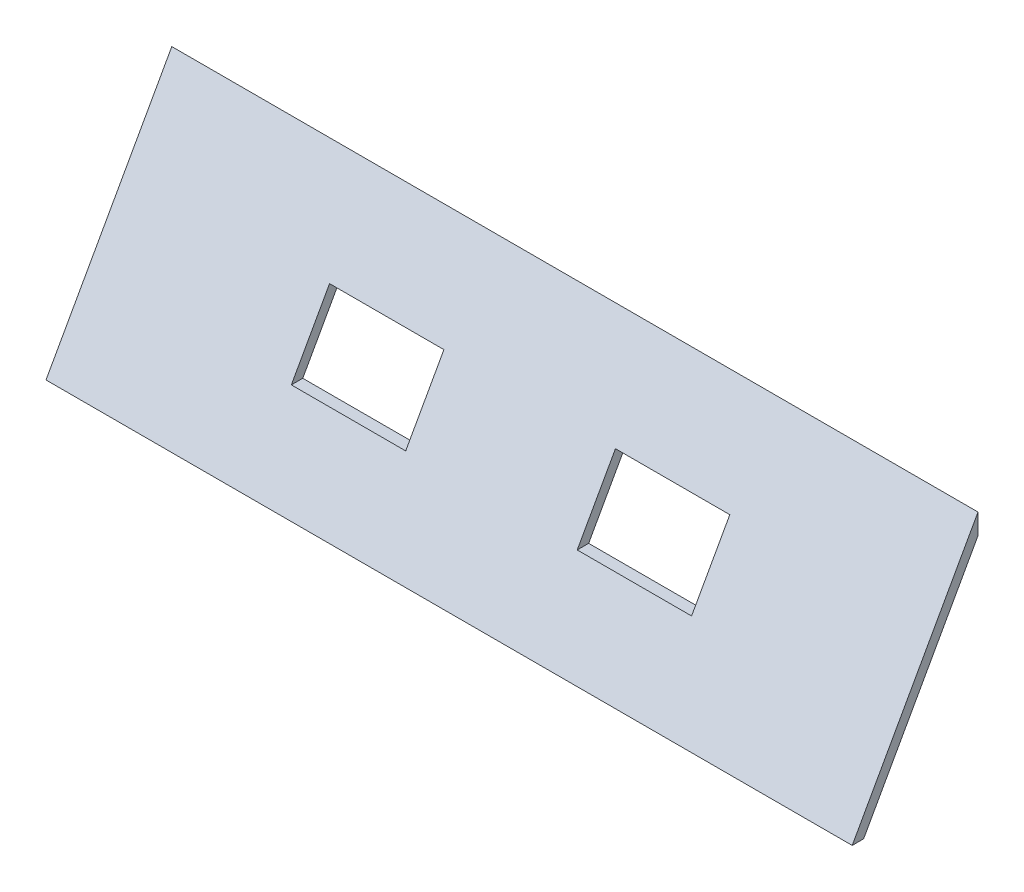
ISO-10303-21;
HEADER;
FILE_DESCRIPTION(('STEP AP214'),'2;1');
FILE_NAME('part.step','',(''),(''),'','','');
FILE_SCHEMA(('AUTOMOTIVE_DESIGN { 1 0 10303 214 1 1 1 1 }'));
ENDSEC;
DATA;
#1=APPLICATION_CONTEXT('core data for automotive mechanical design processes');
#2=APPLICATION_PROTOCOL_DEFINITION('international standard','automotive_design',2000,#1);
#3=PRODUCT_CONTEXT('',#1,'mechanical');
#4=PRODUCT('Part','Part','',(#3));
#5=PRODUCT_RELATED_PRODUCT_CATEGORY('part','',(#4));
#6=PRODUCT_DEFINITION_FORMATION('','',#4);
#7=PRODUCT_DEFINITION_CONTEXT('part definition',#1,'design');
#8=PRODUCT_DEFINITION('design','',#6,#7);
#9=PRODUCT_DEFINITION_SHAPE('','',#8);
#10=(LENGTH_UNIT() NAMED_UNIT(*) SI_UNIT(.MILLI.,.METRE.));
#11=(NAMED_UNIT(*) PLANE_ANGLE_UNIT() SI_UNIT($,.RADIAN.));
#12=(NAMED_UNIT(*) SI_UNIT($,.STERADIAN.) SOLID_ANGLE_UNIT());
#13=UNCERTAINTY_MEASURE_WITH_UNIT(LENGTH_MEASURE(1.E-05),#10,'distance_accuracy_value','');
#14=(GEOMETRIC_REPRESENTATION_CONTEXT(3) GLOBAL_UNCERTAINTY_ASSIGNED_CONTEXT((#13)) GLOBAL_UNIT_ASSIGNED_CONTEXT((#10,
#11,#12)) REPRESENTATION_CONTEXT('',''));
#15=CARTESIAN_POINT('',(0.,0.,0.));
#16=DIRECTION('',(0.,0.,1.));
#17=DIRECTION('',(1.,0.,0.));
#18=AXIS2_PLACEMENT_3D('',#15,#16,#17);
#19=CARTESIAN_POINT('',(-70.5,6.69872981077789,120.));
#20=DIRECTION('',(0.,0.486581594888014,0.873635136379162));
#21=DIRECTION('',(0.,-0.873635136379162,0.486581594888014));
#22=AXIS2_PLACEMENT_3D('',#19,#20,#21);
#23=PLANE('',#22);
#24=DIRECTION('',(0.,0.873635136379162,-0.486581594888014));
#25=VECTOR('',#24,1.);
#26=CARTESIAN_POINT('',(35.,6.69872981077789,120.));
#27=LINE('',#26,#25);
#28=CARTESIAN_POINT('',(35.,20.,112.591697617003));
#29=VERTEX_POINT('',#28);
#30=CARTESIAN_POINT('',(35.,32.,105.908153313993));
#31=VERTEX_POINT('',#30);
#32=EDGE_CURVE('E126',#29,#31,#27,.T.);
#33=ORIENTED_EDGE('',*,*,#32,.F.);
#34=DIRECTION('',(-1.,0.,0.));
#35=VECTOR('',#34,1.);
#36=CARTESIAN_POINT('',(-70.5,20.,112.591697617003));
#37=LINE('',#36,#35);
#38=CARTESIAN_POINT('',(15.,20.,112.591697617003));
#39=VERTEX_POINT('',#38);
#40=EDGE_CURVE('E132',#29,#39,#37,.T.);
#41=ORIENTED_EDGE('',*,*,#40,.T.);
#42=DIRECTION('',(0.,0.873635136379162,-0.486581594888014));
#43=VECTOR('',#42,1.);
#44=CARTESIAN_POINT('',(15.,6.69872981077789,120.));
#45=LINE('',#44,#43);
#46=CARTESIAN_POINT('',(15.,32.,105.908153313993));
#47=VERTEX_POINT('',#46);
#48=EDGE_CURVE('E121',#39,#47,#45,.T.);
#49=ORIENTED_EDGE('',*,*,#48,.T.);
#50=DIRECTION('',(1.,0.,0.));
#51=VECTOR('',#50,1.);
#52=CARTESIAN_POINT('',(-70.5,32.,105.908153313993));
#53=LINE('',#52,#51);
#54=EDGE_CURVE('E140',#47,#31,#53,.T.);
#55=ORIENTED_EDGE('',*,*,#54,.T.);
#56=EDGE_LOOP('',(#33,#41,#49,#55));
#57=FACE_BOUND('',#56,.T.);
#58=DIRECTION('',(1.,0.,0.));
#59=VECTOR('',#58,1.);
#60=CARTESIAN_POINT('',(-70.5,6.69872981077789,120.));
#61=LINE('',#60,#59);
#62=CARTESIAN_POINT('',(-70.5,6.69872981077789,120.));
#63=VERTEX_POINT('',#62);
#64=CARTESIAN_POINT('',(70.5,6.69872981077789,120.));
#65=VERTEX_POINT('',#64);
#66=EDGE_CURVE('E190',#63,#65,#61,.T.);
#67=ORIENTED_EDGE('',*,*,#66,.T.);
#68=DIRECTION('',(0.,-0.873635136379162,0.486581594888014));
#69=VECTOR('',#68,1.);
#70=CARTESIAN_POINT('',(70.5,6.69872981077789,120.));
#71=LINE('',#70,#69);
#72=CARTESIAN_POINT('',(70.5,46.1987298107779,98.0000000025926));
#73=VERTEX_POINT('',#72);
#74=EDGE_CURVE('E166',#73,#65,#71,.T.);
#75=ORIENTED_EDGE('',*,*,#74,.F.);
#76=DIRECTION('',(1.,0.,0.));
#77=VECTOR('',#76,1.);
#78=CARTESIAN_POINT('',(-70.5,46.1987298107779,98.0000000025926));
#79=LINE('',#78,#77);
#80=CARTESIAN_POINT('',(-70.5,46.1987298107779,98.0000000025926));
#81=VERTEX_POINT('',#80);
#82=EDGE_CURVE('E191',#81,#73,#79,.T.);
#83=ORIENTED_EDGE('',*,*,#82,.F.);
#84=DIRECTION('',(0.,-0.873635136379162,0.486581594888014));
#85=VECTOR('',#84,1.);
#86=CARTESIAN_POINT('',(-70.5,6.69872981077789,120.));
#87=LINE('',#86,#85);
#88=EDGE_CURVE('E178',#81,#63,#87,.T.);
#89=ORIENTED_EDGE('',*,*,#88,.T.);
#90=EDGE_LOOP('',(#67,#75,#83,#89));
#91=FACE_BOUND('',#90,.T.);
#92=DIRECTION('',(1.,0.,0.));
#93=VECTOR('',#92,1.);
#94=CARTESIAN_POINT('',(-70.5,20.,112.591697617003));
#95=LINE('',#94,#93);
#96=CARTESIAN_POINT('',(-35.,20.,112.591697617003));
#97=VERTEX_POINT('',#96);
#98=CARTESIAN_POINT('',(-15.,20.,112.591697617003));
#99=VERTEX_POINT('',#98);
#100=EDGE_CURVE('E163',#97,#99,#95,.T.);
#101=ORIENTED_EDGE('',*,*,#100,.F.);
#102=DIRECTION('',(0.,0.873635136379162,-0.486581594888014));
#103=VECTOR('',#102,1.);
#104=CARTESIAN_POINT('',(-35.,6.69872981077789,120.));
#105=LINE('',#104,#103);
#106=CARTESIAN_POINT('',(-35.,32.,105.908153313993));
#107=VERTEX_POINT('',#106);
#108=EDGE_CURVE('E158',#97,#107,#105,.T.);
#109=ORIENTED_EDGE('',*,*,#108,.T.);
#110=DIRECTION('',(-1.,0.,0.));
#111=VECTOR('',#110,1.);
#112=CARTESIAN_POINT('',(-70.5,32.,105.908153313993));
#113=LINE('',#112,#111);
#114=CARTESIAN_POINT('',(-15.,32.,105.908153313993));
#115=VERTEX_POINT('',#114);
#116=EDGE_CURVE('E161',#115,#107,#113,.T.);
#117=ORIENTED_EDGE('',*,*,#116,.F.);
#118=DIRECTION('',(0.,0.873635136379162,-0.486581594888014));
#119=VECTOR('',#118,1.);
#120=CARTESIAN_POINT('',(-15.,6.69872981077789,120.));
#121=LINE('',#120,#119);
#122=EDGE_CURVE('E153',#99,#115,#121,.T.);
#123=ORIENTED_EDGE('',*,*,#122,.F.);
#124=EDGE_LOOP('',(#101,#109,#117,#123));
#125=FACE_BOUND('',#124,.T.);
#126=ADVANCED_FACE('F37',(#57,#91,#125),#23,.T.);
#127=CARTESIAN_POINT('',(-70.5,6.69872981077789,118.));
#128=DIRECTION('',(0.,-0.486581594888014,-0.873635136379162));
#129=DIRECTION('',(0.,0.873635136379162,-0.486581594888014));
#130=AXIS2_PLACEMENT_3D('',#127,#128,#129);
#131=PLANE('',#130);
#132=DIRECTION('',(0.,-0.873635136379162,0.486581594888014));
#133=VECTOR('',#132,1.);
#134=CARTESIAN_POINT('',(35.,6.69872981077789,118.));
#135=LINE('',#134,#133);
#136=CARTESIAN_POINT('',(35.,32.,103.908153313993));
#137=VERTEX_POINT('',#136);
#138=CARTESIAN_POINT('',(35.,20.,110.591697617003));
#139=VERTEX_POINT('',#138);
#140=EDGE_CURVE('E11',#137,#139,#135,.T.);
#141=ORIENTED_EDGE('',*,*,#140,.F.);
#142=DIRECTION('',(-1.,0.,0.));
#143=VECTOR('',#142,1.);
#144=CARTESIAN_POINT('',(-70.5,32.,103.908153313993));
#145=LINE('',#144,#143);
#146=CARTESIAN_POINT('',(15.,32.,103.908153313993));
#147=VERTEX_POINT('',#146);
#148=EDGE_CURVE('E210',#137,#147,#145,.T.);
#149=ORIENTED_EDGE('',*,*,#148,.T.);
#150=DIRECTION('',(0.,-0.873635136379162,0.486581594888014));
#151=VECTOR('',#150,1.);
#152=CARTESIAN_POINT('',(15.,6.69872981077789,118.));
#153=LINE('',#152,#151);
#154=CARTESIAN_POINT('',(15.,20.,110.591697617003));
#155=VERTEX_POINT('',#154);
#156=EDGE_CURVE('E208',#147,#155,#153,.T.);
#157=ORIENTED_EDGE('',*,*,#156,.T.);
#158=DIRECTION('',(1.,0.,0.));
#159=VECTOR('',#158,1.);
#160=CARTESIAN_POINT('',(-70.5,20.,110.591697617003));
#161=LINE('',#160,#159);
#162=EDGE_CURVE('E44',#155,#139,#161,.T.);
#163=ORIENTED_EDGE('',*,*,#162,.T.);
#164=EDGE_LOOP('',(#141,#149,#157,#163));
#165=FACE_BOUND('',#164,.T.);
#166=DIRECTION('',(1.,0.,0.));
#167=VECTOR('',#166,1.);
#168=CARTESIAN_POINT('',(-70.5,42.6078207194456,98.0000000025926));
#169=LINE('',#168,#167);
#170=CARTESIAN_POINT('',(-70.5,42.6078207194456,98.0000000025926));
#171=VERTEX_POINT('',#170);
#172=CARTESIAN_POINT('',(70.5,42.6078207194456,98.0000000025926));
#173=VERTEX_POINT('',#172);
#174=EDGE_CURVE('E194',#171,#173,#169,.T.);
#175=ORIENTED_EDGE('',*,*,#174,.T.);
#176=DIRECTION('',(0.,0.873635136379162,-0.486581594888014));
#177=VECTOR('',#176,1.);
#178=CARTESIAN_POINT('',(70.5,6.69872981077789,118.));
#179=LINE('',#178,#177);
#180=CARTESIAN_POINT('',(70.5,6.69872981077789,118.));
#181=VERTEX_POINT('',#180);
#182=EDGE_CURVE('E172',#181,#173,#179,.T.);
#183=ORIENTED_EDGE('',*,*,#182,.F.);
#184=DIRECTION('',(1.,0.,0.));
#185=VECTOR('',#184,1.);
#186=CARTESIAN_POINT('',(-70.5,6.69872981077789,118.));
#187=LINE('',#186,#185);
#188=CARTESIAN_POINT('',(-70.5,6.69872981077789,118.));
#189=VERTEX_POINT('',#188);
#190=EDGE_CURVE('E196',#189,#181,#187,.T.);
#191=ORIENTED_EDGE('',*,*,#190,.F.);
#192=DIRECTION('',(0.,0.873635136379162,-0.486581594888014));
#193=VECTOR('',#192,1.);
#194=CARTESIAN_POINT('',(-70.5,6.69872981077789,118.));
#195=LINE('',#194,#193);
#196=EDGE_CURVE('E184',#189,#171,#195,.T.);
#197=ORIENTED_EDGE('',*,*,#196,.T.);
#198=EDGE_LOOP('',(#175,#183,#191,#197));
#199=FACE_BOUND('',#198,.T.);
#200=DIRECTION('',(1.,0.,0.));
#201=VECTOR('',#200,1.);
#202=CARTESIAN_POINT('',(-70.5,32.,103.908153313993));
#203=LINE('',#202,#201);
#204=CARTESIAN_POINT('',(-35.,32.,103.908153313993));
#205=VERTEX_POINT('',#204);
#206=CARTESIAN_POINT('',(-15.,32.,103.908153313993));
#207=VERTEX_POINT('',#206);
#208=EDGE_CURVE('E200',#205,#207,#203,.T.);
#209=ORIENTED_EDGE('',*,*,#208,.F.);
#210=DIRECTION('',(0.,-0.873635136379162,0.486581594888014));
#211=VECTOR('',#210,1.);
#212=CARTESIAN_POINT('',(-35.,6.69872981077789,118.));
#213=LINE('',#212,#211);
#214=CARTESIAN_POINT('',(-35.,20.,110.591697617003));
#215=VERTEX_POINT('',#214);
#216=EDGE_CURVE('E205',#205,#215,#213,.T.);
#217=ORIENTED_EDGE('',*,*,#216,.T.);
#218=DIRECTION('',(-1.,0.,0.));
#219=VECTOR('',#218,1.);
#220=CARTESIAN_POINT('',(-70.5,20.,110.591697617003));
#221=LINE('',#220,#219);
#222=CARTESIAN_POINT('',(-15.,20.,110.591697617003));
#223=VERTEX_POINT('',#222);
#224=EDGE_CURVE('E203',#223,#215,#221,.T.);
#225=ORIENTED_EDGE('',*,*,#224,.F.);
#226=DIRECTION('',(0.,-0.873635136379162,0.486581594888014));
#227=VECTOR('',#226,1.);
#228=CARTESIAN_POINT('',(-15.,6.69872981077789,118.));
#229=LINE('',#228,#227);
#230=EDGE_CURVE('E193',#207,#223,#229,.T.);
#231=ORIENTED_EDGE('',*,*,#230,.F.);
#232=EDGE_LOOP('',(#209,#217,#225,#231));
#233=FACE_BOUND('',#232,.T.);
#234=ADVANCED_FACE('F214',(#165,#199,#233),#131,.T.);
#235=CARTESIAN_POINT('',(-70.5,42.6078207194456,98.0000000025926));
#236=DIRECTION('',(0.,0.,-1.));
#237=DIRECTION('',(-1.,0.,0.));
#238=AXIS2_PLACEMENT_3D('',#235,#236,#237);
#239=PLANE('',#238);
#240=ORIENTED_EDGE('',*,*,#82,.T.);
#241=DIRECTION('',(0.,1.,0.));
#242=VECTOR('',#241,1.);
#243=CARTESIAN_POINT('',(70.5,42.6078207194456,98.0000000025926));
#244=LINE('',#243,#242);
#245=EDGE_CURVE('E175',#173,#73,#244,.T.);
#246=ORIENTED_EDGE('',*,*,#245,.F.);
#247=ORIENTED_EDGE('',*,*,#174,.F.);
#248=DIRECTION('',(0.,1.,0.));
#249=VECTOR('',#248,1.);
#250=CARTESIAN_POINT('',(-70.5,42.6078207194456,98.0000000025926));
#251=LINE('',#250,#249);
#252=EDGE_CURVE('E187',#171,#81,#251,.T.);
#253=ORIENTED_EDGE('',*,*,#252,.T.);
#254=EDGE_LOOP('',(#240,#246,#247,#253));
#255=FACE_BOUND('',#254,.T.);
#256=ADVANCED_FACE('F238',(#255),#239,.T.);
#257=CARTESIAN_POINT('',(-70.5,6.69872981077789,120.));
#258=DIRECTION('',(0.,-1.,0.));
#259=DIRECTION('',(0.,0.,-1.));
#260=AXIS2_PLACEMENT_3D('',#257,#258,#259);
#261=PLANE('',#260);
#262=ORIENTED_EDGE('',*,*,#190,.T.);
#263=DIRECTION('',(0.,0.,-1.));
#264=VECTOR('',#263,1.);
#265=CARTESIAN_POINT('',(70.5,6.69872981077789,120.));
#266=LINE('',#265,#264);
#267=EDGE_CURVE('E169',#65,#181,#266,.T.);
#268=ORIENTED_EDGE('',*,*,#267,.F.);
#269=ORIENTED_EDGE('',*,*,#66,.F.);
#270=DIRECTION('',(0.,0.,-1.));
#271=VECTOR('',#270,1.);
#272=CARTESIAN_POINT('',(-70.5,6.69872981077789,120.));
#273=LINE('',#272,#271);
#274=EDGE_CURVE('E181',#63,#189,#273,.T.);
#275=ORIENTED_EDGE('',*,*,#274,.T.);
#276=EDGE_LOOP('',(#262,#268,#269,#275));
#277=FACE_BOUND('',#276,.T.);
#278=ADVANCED_FACE('F243',(#277),#261,.T.);
#279=CARTESIAN_POINT('',(-70.5,0.,0.));
#280=DIRECTION('',(-1.,0.,0.));
#281=DIRECTION('',(0.,0.,1.));
#282=AXIS2_PLACEMENT_3D('',#279,#280,#281);
#283=PLANE('',#282);
#284=ORIENTED_EDGE('',*,*,#88,.F.);
#285=ORIENTED_EDGE('',*,*,#252,.F.);
#286=ORIENTED_EDGE('',*,*,#196,.F.);
#287=ORIENTED_EDGE('',*,*,#274,.F.);
#288=EDGE_LOOP('',(#284,#285,#286,#287));
#289=FACE_BOUND('',#288,.T.);
#290=ADVANCED_FACE('F248',(#289),#283,.T.);
#291=CARTESIAN_POINT('',(70.5,0.,0.));
#292=DIRECTION('',(-1.,0.,0.));
#293=DIRECTION('',(0.,0.,1.));
#294=AXIS2_PLACEMENT_3D('',#291,#292,#293);
#295=PLANE('',#294);
#296=ORIENTED_EDGE('',*,*,#74,.T.);
#297=ORIENTED_EDGE('',*,*,#267,.T.);
#298=ORIENTED_EDGE('',*,*,#182,.T.);
#299=ORIENTED_EDGE('',*,*,#245,.T.);
#300=EDGE_LOOP('',(#296,#297,#298,#299));
#301=FACE_BOUND('',#300,.T.);
#302=ADVANCED_FACE('F253',(#301),#295,.F.);
#303=CARTESIAN_POINT('',(-35.,20.,112.592592592593));
#304=DIRECTION('',(0.,-1.,0.));
#305=DIRECTION('',(0.,0.,-1.));
#306=AXIS2_PLACEMENT_3D('',#303,#304,#305);
#307=PLANE('',#306);
#308=ORIENTED_EDGE('',*,*,#100,.T.);
#309=DIRECTION('',(0.,0.,-1.));
#310=VECTOR('',#309,1.);
#311=CARTESIAN_POINT('',(-15.,20.,112.592592592593));
#312=LINE('',#311,#310);
#313=EDGE_CURVE('E139',#99,#223,#312,.T.);
#314=ORIENTED_EDGE('',*,*,#313,.T.);
#315=ORIENTED_EDGE('',*,*,#224,.T.);
#316=DIRECTION('',(0.,0.,-1.));
#317=VECTOR('',#316,1.);
#318=CARTESIAN_POINT('',(-35.,20.,112.592592592593));
#319=LINE('',#318,#317);
#320=EDGE_CURVE('E148',#97,#215,#319,.T.);
#321=ORIENTED_EDGE('',*,*,#320,.F.);
#322=EDGE_LOOP('',(#308,#314,#315,#321));
#323=FACE_BOUND('',#322,.T.);
#324=ADVANCED_FACE('F271',(#323),#307,.F.);
#325=CARTESIAN_POINT('',(-35.,32.,98.0000000025926));
#326=DIRECTION('',(0.,1.,0.));
#327=DIRECTION('',(0.,0.,1.));
#328=AXIS2_PLACEMENT_3D('',#325,#326,#327);
#329=PLANE('',#328);
#330=ORIENTED_EDGE('',*,*,#116,.T.);
#331=DIRECTION('',(0.,0.,1.));
#332=VECTOR('',#331,1.);
#333=CARTESIAN_POINT('',(-35.,32.,98.0000000025926));
#334=LINE('',#333,#332);
#335=EDGE_CURVE('E151',#205,#107,#334,.T.);
#336=ORIENTED_EDGE('',*,*,#335,.F.);
#337=ORIENTED_EDGE('',*,*,#208,.T.);
#338=DIRECTION('',(0.,0.,1.));
#339=VECTOR('',#338,1.);
#340=CARTESIAN_POINT('',(-15.,32.,98.0000000025926));
#341=LINE('',#340,#339);
#342=EDGE_CURVE('E143',#207,#115,#341,.T.);
#343=ORIENTED_EDGE('',*,*,#342,.T.);
#344=EDGE_LOOP('',(#330,#336,#337,#343));
#345=FACE_BOUND('',#344,.T.);
#346=ADVANCED_FACE('F279',(#345),#329,.F.);
#347=CARTESIAN_POINT('',(-35.,0.,0.));
#348=DIRECTION('',(1.,0.,0.));
#349=DIRECTION('',(0.,0.,-1.));
#350=AXIS2_PLACEMENT_3D('',#347,#348,#349);
#351=PLANE('',#350);
#352=ORIENTED_EDGE('',*,*,#320,.T.);
#353=ORIENTED_EDGE('',*,*,#216,.F.);
#354=ORIENTED_EDGE('',*,*,#335,.T.);
#355=ORIENTED_EDGE('',*,*,#108,.F.);
#356=EDGE_LOOP('',(#352,#353,#354,#355));
#357=FACE_BOUND('',#356,.T.);
#358=ADVANCED_FACE('F274',(#357),#351,.T.);
#359=CARTESIAN_POINT('',(-15.,0.,0.));
#360=DIRECTION('',(1.,0.,0.));
#361=DIRECTION('',(0.,0.,-1.));
#362=AXIS2_PLACEMENT_3D('',#359,#360,#361);
#363=PLANE('',#362);
#364=ORIENTED_EDGE('',*,*,#122,.T.);
#365=ORIENTED_EDGE('',*,*,#342,.F.);
#366=ORIENTED_EDGE('',*,*,#230,.T.);
#367=ORIENTED_EDGE('',*,*,#313,.F.);
#368=EDGE_LOOP('',(#364,#365,#366,#367));
#369=FACE_BOUND('',#368,.T.);
#370=ADVANCED_FACE('F281',(#369),#363,.F.);
#371=CARTESIAN_POINT('',(35.,20.,112.592592592593));
#372=DIRECTION('',(0.,1.,0.));
#373=DIRECTION('',(0.,0.,1.));
#374=AXIS2_PLACEMENT_3D('',#371,#372,#373);
#375=PLANE('',#374);
#376=DIRECTION('',(0.,0.,-1.));
#377=VECTOR('',#376,1.);
#378=CARTESIAN_POINT('',(35.,20.,112.592592592593));
#379=LINE('',#378,#377);
#380=EDGE_CURVE('E220',#29,#139,#379,.T.);
#381=ORIENTED_EDGE('',*,*,#380,.T.);
#382=ORIENTED_EDGE('',*,*,#162,.F.);
#383=DIRECTION('',(0.,0.,-1.));
#384=VECTOR('',#383,1.);
#385=CARTESIAN_POINT('',(15.,20.,112.592592592593));
#386=LINE('',#385,#384);
#387=EDGE_CURVE('E56',#39,#155,#386,.T.);
#388=ORIENTED_EDGE('',*,*,#387,.F.);
#389=ORIENTED_EDGE('',*,*,#40,.F.);
#390=EDGE_LOOP('',(#381,#382,#388,#389));
#391=FACE_BOUND('',#390,.T.);
#392=ADVANCED_FACE('F131',(#391),#375,.T.);
#393=CARTESIAN_POINT('',(35.,32.,98.0000000025926));
#394=DIRECTION('',(0.,-1.,0.));
#395=DIRECTION('',(0.,0.,-1.));
#396=AXIS2_PLACEMENT_3D('',#393,#394,#395);
#397=PLANE('',#396);
#398=DIRECTION('',(0.,0.,1.));
#399=VECTOR('',#398,1.);
#400=CARTESIAN_POINT('',(15.,32.,98.0000000025926));
#401=LINE('',#400,#399);
#402=EDGE_CURVE('E51',#147,#47,#401,.T.);
#403=ORIENTED_EDGE('',*,*,#402,.F.);
#404=ORIENTED_EDGE('',*,*,#148,.F.);
#405=DIRECTION('',(0.,0.,1.));
#406=VECTOR('',#405,1.);
#407=CARTESIAN_POINT('',(35.,32.,98.0000000025926));
#408=LINE('',#407,#406);
#409=EDGE_CURVE('E127',#137,#31,#408,.T.);
#410=ORIENTED_EDGE('',*,*,#409,.T.);
#411=ORIENTED_EDGE('',*,*,#54,.F.);
#412=EDGE_LOOP('',(#403,#404,#410,#411));
#413=FACE_BOUND('',#412,.T.);
#414=ADVANCED_FACE('F217',(#413),#397,.T.);
#415=CARTESIAN_POINT('',(35.,0.,0.));
#416=DIRECTION('',(1.,0.,0.));
#417=DIRECTION('',(0.,0.,-1.));
#418=AXIS2_PLACEMENT_3D('',#415,#416,#417);
#419=PLANE('',#418);
#420=ORIENTED_EDGE('',*,*,#32,.T.);
#421=ORIENTED_EDGE('',*,*,#409,.F.);
#422=ORIENTED_EDGE('',*,*,#140,.T.);
#423=ORIENTED_EDGE('',*,*,#380,.F.);
#424=EDGE_LOOP('',(#420,#421,#422,#423));
#425=FACE_BOUND('',#424,.T.);
#426=ADVANCED_FACE('F225',(#425),#419,.F.);
#427=CARTESIAN_POINT('',(15.,0.,0.));
#428=DIRECTION('',(1.,0.,0.));
#429=DIRECTION('',(0.,0.,-1.));
#430=AXIS2_PLACEMENT_3D('',#427,#428,#429);
#431=PLANE('',#430);
#432=ORIENTED_EDGE('',*,*,#387,.T.);
#433=ORIENTED_EDGE('',*,*,#156,.F.);
#434=ORIENTED_EDGE('',*,*,#402,.T.);
#435=ORIENTED_EDGE('',*,*,#48,.F.);
#436=EDGE_LOOP('',(#432,#433,#434,#435));
#437=FACE_BOUND('',#436,.T.);
#438=ADVANCED_FACE('F122',(#437),#431,.T.);
#439=CLOSED_SHELL('',(#126,#234,#256,#278,#290,#302,#324,#346,#358,#370,#392,#414,#426,#438));
#440=MANIFOLD_SOLID_BREP('B2',#439);
#441=ADVANCED_BREP_SHAPE_REPRESENTATION('',(#18,#440),#14);
#442=SHAPE_DEFINITION_REPRESENTATION(#9,#441);
ENDSEC;
END-ISO-10303-21;
